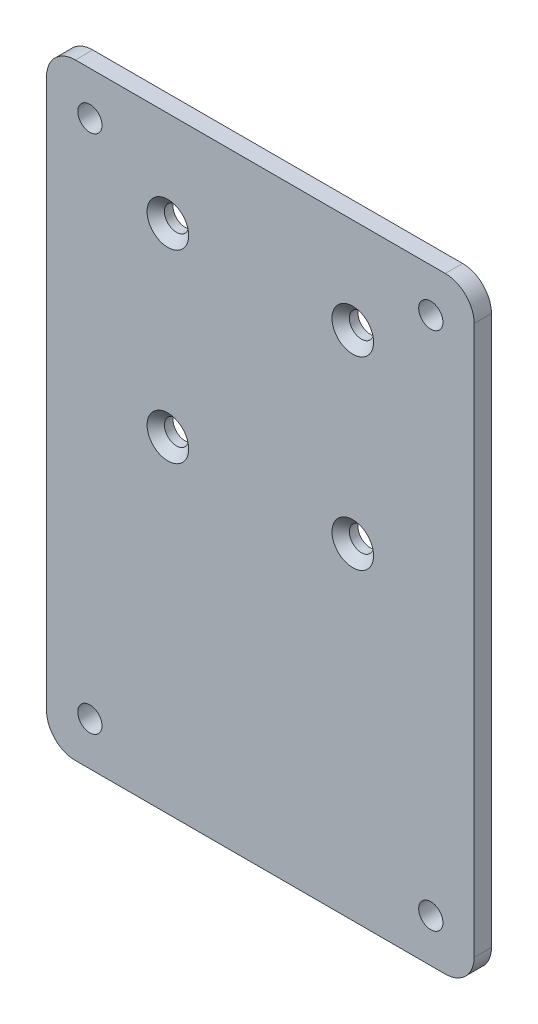
ISO-10303-21;
HEADER;
FILE_DESCRIPTION(('STEP AP214'),'2;1');
FILE_NAME('part.step','',(''),(''),'','','');
FILE_SCHEMA(('AUTOMOTIVE_DESIGN { 1 0 10303 214 1 1 1 1 }'));
ENDSEC;
DATA;
#1=APPLICATION_CONTEXT('core data for automotive mechanical design processes');
#2=APPLICATION_PROTOCOL_DEFINITION('international standard','automotive_design',2000,#1);
#3=PRODUCT_CONTEXT('',#1,'mechanical');
#4=PRODUCT('Part','Part','',(#3));
#5=PRODUCT_RELATED_PRODUCT_CATEGORY('part','',(#4));
#6=PRODUCT_DEFINITION_FORMATION('','',#4);
#7=PRODUCT_DEFINITION_CONTEXT('part definition',#1,'design');
#8=PRODUCT_DEFINITION('design','',#6,#7);
#9=PRODUCT_DEFINITION_SHAPE('','',#8);
#10=(LENGTH_UNIT() NAMED_UNIT(*) SI_UNIT(.MILLI.,.METRE.));
#11=(NAMED_UNIT(*) PLANE_ANGLE_UNIT() SI_UNIT($,.RADIAN.));
#12=(NAMED_UNIT(*) SI_UNIT($,.STERADIAN.) SOLID_ANGLE_UNIT());
#13=UNCERTAINTY_MEASURE_WITH_UNIT(LENGTH_MEASURE(1.E-05),#10,'distance_accuracy_value','');
#14=(GEOMETRIC_REPRESENTATION_CONTEXT(3) GLOBAL_UNCERTAINTY_ASSIGNED_CONTEXT((#13)) GLOBAL_UNIT_ASSIGNED_CONTEXT((#10,
#11,#12)) REPRESENTATION_CONTEXT('',''));
#15=CARTESIAN_POINT('',(0.,0.,0.));
#16=DIRECTION('',(0.,0.,1.));
#17=DIRECTION('',(1.,0.,0.));
#18=AXIS2_PLACEMENT_3D('',#15,#16,#17);
#19=CARTESIAN_POINT('',(0.,0.,3.));
#20=DIRECTION('',(0.,0.,1.));
#21=DIRECTION('',(1.,0.,0.));
#22=AXIS2_PLACEMENT_3D('',#19,#20,#21);
#23=PLANE('',#22);
#24=CARTESIAN_POINT('',(16.,4.,3.));
#25=DIRECTION('',(0.,0.,1.));
#26=DIRECTION('',(1.,0.,0.));
#27=AXIS2_PLACEMENT_3D('',#24,#25,#26);
#28=CIRCLE('',#27,3.59999999999999);
#29=CARTESIAN_POINT('',(19.6,4.,3.));
#30=VERTEX_POINT('',#29);
#31=EDGE_CURVE('E184',#30,#30,#28,.F.);
#32=ORIENTED_EDGE('',*,*,#31,.T.);
#33=EDGE_LOOP('',(#32));
#34=FACE_BOUND('',#33,.T.);
#35=CARTESIAN_POINT('',(-16.,4.,3.));
#36=DIRECTION('',(0.,0.,1.));
#37=DIRECTION('',(1.,0.,0.));
#38=AXIS2_PLACEMENT_3D('',#35,#36,#37);
#39=CIRCLE('',#38,3.59999999999999);
#40=CARTESIAN_POINT('',(-12.4,4.,3.));
#41=VERTEX_POINT('',#40);
#42=EDGE_CURVE('E181',#41,#41,#39,.F.);
#43=ORIENTED_EDGE('',*,*,#42,.T.);
#44=EDGE_LOOP('',(#43));
#45=FACE_BOUND('',#44,.T.);
#46=CARTESIAN_POINT('',(-16.,36.,3.));
#47=DIRECTION('',(0.,0.,1.));
#48=DIRECTION('',(1.,0.,0.));
#49=AXIS2_PLACEMENT_3D('',#46,#47,#48);
#50=CIRCLE('',#49,3.59999999999999);
#51=CARTESIAN_POINT('',(-12.4,36.,3.));
#52=VERTEX_POINT('',#51);
#53=EDGE_CURVE('E178',#52,#52,#50,.F.);
#54=ORIENTED_EDGE('',*,*,#53,.T.);
#55=EDGE_LOOP('',(#54));
#56=FACE_BOUND('',#55,.T.);
#57=CARTESIAN_POINT('',(16.,36.,3.));
#58=DIRECTION('',(0.,0.,1.));
#59=DIRECTION('',(1.,0.,0.));
#60=AXIS2_PLACEMENT_3D('',#57,#58,#59);
#61=CIRCLE('',#60,3.59999999999999);
#62=CARTESIAN_POINT('',(19.6,36.,3.));
#63=VERTEX_POINT('',#62);
#64=EDGE_CURVE('E175',#63,#63,#61,.F.);
#65=ORIENTED_EDGE('',*,*,#64,.T.);
#66=EDGE_LOOP('',(#65));
#67=FACE_BOUND('',#66,.T.);
#68=CARTESIAN_POINT('',(29.5,45.,3.));
#69=DIRECTION('',(0.,0.,1.));
#70=DIRECTION('',(1.,0.,0.));
#71=AXIS2_PLACEMENT_3D('',#68,#69,#70);
#72=CIRCLE('',#71,2.10000000000002);
#73=CARTESIAN_POINT('',(31.6,45.,3.));
#74=VERTEX_POINT('',#73);
#75=EDGE_CURVE('E322',#74,#74,#72,.T.);
#76=ORIENTED_EDGE('',*,*,#75,.F.);
#77=EDGE_LOOP('',(#76));
#78=FACE_BOUND('',#77,.T.);
#79=CARTESIAN_POINT('',(-29.5,45.,3.));
#80=DIRECTION('',(0.,0.,1.));
#81=DIRECTION('',(1.,0.,0.));
#82=AXIS2_PLACEMENT_3D('',#79,#80,#81);
#83=CIRCLE('',#82,2.1);
#84=CARTESIAN_POINT('',(-27.4,45.,3.));
#85=VERTEX_POINT('',#84);
#86=EDGE_CURVE('E278',#85,#85,#83,.T.);
#87=ORIENTED_EDGE('',*,*,#86,.F.);
#88=EDGE_LOOP('',(#87));
#89=FACE_BOUND('',#88,.T.);
#90=DIRECTION('',(0.,-1.,0.));
#91=VECTOR('',#90,1.);
#92=CARTESIAN_POINT('',(-37.,52.5,3.));
#93=LINE('',#92,#91);
#94=CARTESIAN_POINT('',(-37.,47.5,3.));
#95=VERTEX_POINT('',#94);
#96=CARTESIAN_POINT('',(-37.,-47.5,3.));
#97=VERTEX_POINT('',#96);
#98=EDGE_CURVE('E295',#95,#97,#93,.T.);
#99=ORIENTED_EDGE('',*,*,#98,.T.);
#100=CARTESIAN_POINT('',(-32.,-47.5,3.));
#101=DIRECTION('',(0.,0.,1.));
#102=DIRECTION('',(1.,0.,0.));
#103=AXIS2_PLACEMENT_3D('',#100,#101,#102);
#104=CIRCLE('',#103,5.);
#105=CARTESIAN_POINT('',(-32.,-52.5,3.));
#106=VERTEX_POINT('',#105);
#107=EDGE_CURVE('E161',#97,#106,#104,.T.);
#108=ORIENTED_EDGE('',*,*,#107,.T.);
#109=DIRECTION('',(1.,0.,0.));
#110=VECTOR('',#109,1.);
#111=CARTESIAN_POINT('',(-37.,-52.5,3.));
#112=LINE('',#111,#110);
#113=CARTESIAN_POINT('',(32.,-52.5,3.));
#114=VERTEX_POINT('',#113);
#115=EDGE_CURVE('E132',#106,#114,#112,.T.);
#116=ORIENTED_EDGE('',*,*,#115,.T.);
#117=CARTESIAN_POINT('',(32.,-47.5,3.));
#118=DIRECTION('',(0.,0.,1.));
#119=DIRECTION('',(1.,0.,0.));
#120=AXIS2_PLACEMENT_3D('',#117,#118,#119);
#121=CIRCLE('',#120,5.);
#122=CARTESIAN_POINT('',(37.,-47.5,3.));
#123=VERTEX_POINT('',#122);
#124=EDGE_CURVE('E159',#114,#123,#121,.T.);
#125=ORIENTED_EDGE('',*,*,#124,.T.);
#126=DIRECTION('',(0.,1.,0.));
#127=VECTOR('',#126,1.);
#128=CARTESIAN_POINT('',(37.,52.5,3.));
#129=LINE('',#128,#127);
#130=CARTESIAN_POINT('',(37.,47.5,3.));
#131=VERTEX_POINT('',#130);
#132=EDGE_CURVE('E139',#123,#131,#129,.T.);
#133=ORIENTED_EDGE('',*,*,#132,.T.);
#134=CARTESIAN_POINT('',(32.,47.5,3.));
#135=DIRECTION('',(0.,0.,1.));
#136=DIRECTION('',(1.,0.,0.));
#137=AXIS2_PLACEMENT_3D('',#134,#135,#136);
#138=CIRCLE('',#137,5.);
#139=CARTESIAN_POINT('',(32.,52.5,3.));
#140=VERTEX_POINT('',#139);
#141=EDGE_CURVE('E67',#131,#140,#138,.T.);
#142=ORIENTED_EDGE('',*,*,#141,.T.);
#143=DIRECTION('',(-1.,0.,0.));
#144=VECTOR('',#143,1.);
#145=CARTESIAN_POINT('',(-37.,52.5,3.));
#146=LINE('',#145,#144);
#147=CARTESIAN_POINT('',(-32.,52.5,3.));
#148=VERTEX_POINT('',#147);
#149=EDGE_CURVE('E142',#140,#148,#146,.T.);
#150=ORIENTED_EDGE('',*,*,#149,.T.);
#151=CARTESIAN_POINT('',(-32.,47.5,3.));
#152=DIRECTION('',(0.,0.,1.));
#153=DIRECTION('',(1.,0.,0.));
#154=AXIS2_PLACEMENT_3D('',#151,#152,#153);
#155=CIRCLE('',#154,5.);
#156=EDGE_CURVE('E157',#148,#95,#155,.T.);
#157=ORIENTED_EDGE('',*,*,#156,.T.);
#158=EDGE_LOOP('',(#99,#108,#116,#125,#133,#142,#150,#157));
#159=FACE_BOUND('',#158,.T.);
#160=CARTESIAN_POINT('',(-29.5,-45.,3.));
#161=DIRECTION('',(0.,0.,1.));
#162=DIRECTION('',(1.,0.,0.));
#163=AXIS2_PLACEMENT_3D('',#160,#161,#162);
#164=CIRCLE('',#163,2.1);
#165=CARTESIAN_POINT('',(-27.4,-45.,3.));
#166=VERTEX_POINT('',#165);
#167=EDGE_CURVE('E313',#166,#166,#164,.T.);
#168=ORIENTED_EDGE('',*,*,#167,.F.);
#169=EDGE_LOOP('',(#168));
#170=FACE_BOUND('',#169,.T.);
#171=CARTESIAN_POINT('',(29.5,-45.,3.));
#172=DIRECTION('',(0.,0.,1.));
#173=DIRECTION('',(1.,0.,0.));
#174=AXIS2_PLACEMENT_3D('',#171,#172,#173);
#175=CIRCLE('',#174,2.10000000000002);
#176=CARTESIAN_POINT('',(31.6,-45.,3.));
#177=VERTEX_POINT('',#176);
#178=EDGE_CURVE('E316',#177,#177,#175,.T.);
#179=ORIENTED_EDGE('',*,*,#178,.F.);
#180=EDGE_LOOP('',(#179));
#181=FACE_BOUND('',#180,.T.);
#182=ADVANCED_FACE('F44',(#34,#45,#56,#67,#78,#89,#159,#170,#181),#23,.T.);
#183=CARTESIAN_POINT('',(0.,0.,0.));
#184=DIRECTION('',(0.,0.,1.));
#185=DIRECTION('',(1.,0.,0.));
#186=AXIS2_PLACEMENT_3D('',#183,#184,#185);
#187=PLANE('',#186);
#188=DIRECTION('',(1.,0.,0.));
#189=VECTOR('',#188,1.);
#190=CARTESIAN_POINT('',(-37.,-52.5,0.));
#191=LINE('',#190,#189);
#192=CARTESIAN_POINT('',(-32.,-52.5,0.));
#193=VERTEX_POINT('',#192);
#194=CARTESIAN_POINT('',(32.,-52.5,0.));
#195=VERTEX_POINT('',#194);
#196=EDGE_CURVE('E129',#193,#195,#191,.T.);
#197=ORIENTED_EDGE('',*,*,#196,.F.);
#198=CARTESIAN_POINT('',(-32.,-47.5,0.));
#199=DIRECTION('',(0.,0.,1.));
#200=DIRECTION('',(1.,0.,0.));
#201=AXIS2_PLACEMENT_3D('',#198,#199,#200);
#202=CIRCLE('',#201,5.);
#203=CARTESIAN_POINT('',(-37.,-47.5,0.));
#204=VERTEX_POINT('',#203);
#205=EDGE_CURVE('E112',#193,#204,#202,.F.);
#206=ORIENTED_EDGE('',*,*,#205,.T.);
#207=DIRECTION('',(0.,-1.,0.));
#208=VECTOR('',#207,1.);
#209=CARTESIAN_POINT('',(-37.,52.5,0.));
#210=LINE('',#209,#208);
#211=CARTESIAN_POINT('',(-37.,47.5,0.));
#212=VERTEX_POINT('',#211);
#213=EDGE_CURVE('E140',#212,#204,#210,.T.);
#214=ORIENTED_EDGE('',*,*,#213,.F.);
#215=CARTESIAN_POINT('',(-32.,47.5,0.));
#216=DIRECTION('',(0.,0.,1.));
#217=DIRECTION('',(1.,0.,0.));
#218=AXIS2_PLACEMENT_3D('',#215,#216,#217);
#219=CIRCLE('',#218,5.);
#220=CARTESIAN_POINT('',(-32.,52.5,0.));
#221=VERTEX_POINT('',#220);
#222=EDGE_CURVE('E150',#212,#221,#219,.F.);
#223=ORIENTED_EDGE('',*,*,#222,.T.);
#224=DIRECTION('',(-1.,0.,0.));
#225=VECTOR('',#224,1.);
#226=CARTESIAN_POINT('',(-37.,52.5,0.));
#227=LINE('',#226,#225);
#228=CARTESIAN_POINT('',(32.,52.5,0.));
#229=VERTEX_POINT('',#228);
#230=EDGE_CURVE('E144',#229,#221,#227,.T.);
#231=ORIENTED_EDGE('',*,*,#230,.F.);
#232=CARTESIAN_POINT('',(32.,47.5,0.));
#233=DIRECTION('',(0.,0.,1.));
#234=DIRECTION('',(1.,0.,0.));
#235=AXIS2_PLACEMENT_3D('',#232,#233,#234);
#236=CIRCLE('',#235,5.);
#237=CARTESIAN_POINT('',(37.,47.5,0.));
#238=VERTEX_POINT('',#237);
#239=EDGE_CURVE('E133',#229,#238,#236,.F.);
#240=ORIENTED_EDGE('',*,*,#239,.T.);
#241=DIRECTION('',(0.,1.,0.));
#242=VECTOR('',#241,1.);
#243=CARTESIAN_POINT('',(37.,52.5,0.));
#244=LINE('',#243,#242);
#245=CARTESIAN_POINT('',(37.,-47.5,0.));
#246=VERTEX_POINT('',#245);
#247=EDGE_CURVE('E292',#246,#238,#244,.T.);
#248=ORIENTED_EDGE('',*,*,#247,.F.);
#249=CARTESIAN_POINT('',(32.,-47.5,0.));
#250=DIRECTION('',(0.,0.,1.));
#251=DIRECTION('',(1.,0.,0.));
#252=AXIS2_PLACEMENT_3D('',#249,#250,#251);
#253=CIRCLE('',#252,5.);
#254=EDGE_CURVE('E123',#246,#195,#253,.F.);
#255=ORIENTED_EDGE('',*,*,#254,.T.);
#256=EDGE_LOOP('',(#197,#206,#214,#223,#231,#240,#248,#255));
#257=FACE_BOUND('',#256,.T.);
#258=CARTESIAN_POINT('',(-16.,36.,0.));
#259=DIRECTION('',(0.,0.,1.));
#260=DIRECTION('',(1.,0.,0.));
#261=AXIS2_PLACEMENT_3D('',#258,#259,#260);
#262=CIRCLE('',#261,2.1);
#263=CARTESIAN_POINT('',(-13.9,36.,0.));
#264=VERTEX_POINT('',#263);
#265=EDGE_CURVE('E290',#264,#264,#262,.T.);
#266=ORIENTED_EDGE('',*,*,#265,.T.);
#267=EDGE_LOOP('',(#266));
#268=FACE_BOUND('',#267,.T.);
#269=CARTESIAN_POINT('',(16.,36.,0.));
#270=DIRECTION('',(0.,0.,1.));
#271=DIRECTION('',(1.,0.,0.));
#272=AXIS2_PLACEMENT_3D('',#269,#270,#271);
#273=CIRCLE('',#272,2.1);
#274=CARTESIAN_POINT('',(18.1,36.,0.));
#275=VERTEX_POINT('',#274);
#276=EDGE_CURVE('E281',#275,#275,#273,.T.);
#277=ORIENTED_EDGE('',*,*,#276,.T.);
#278=EDGE_LOOP('',(#277));
#279=FACE_BOUND('',#278,.T.);
#280=CARTESIAN_POINT('',(-16.,4.,0.));
#281=DIRECTION('',(0.,0.,1.));
#282=DIRECTION('',(1.,0.,0.));
#283=AXIS2_PLACEMENT_3D('',#280,#281,#282);
#284=CIRCLE('',#283,2.1);
#285=CARTESIAN_POINT('',(-13.9,4.,0.));
#286=VERTEX_POINT('',#285);
#287=EDGE_CURVE('E277',#286,#286,#284,.T.);
#288=ORIENTED_EDGE('',*,*,#287,.T.);
#289=EDGE_LOOP('',(#288));
#290=FACE_BOUND('',#289,.T.);
#291=CARTESIAN_POINT('',(16.,4.,0.));
#292=DIRECTION('',(0.,0.,1.));
#293=DIRECTION('',(1.,0.,0.));
#294=AXIS2_PLACEMENT_3D('',#291,#292,#293);
#295=CIRCLE('',#294,2.1);
#296=CARTESIAN_POINT('',(18.1,4.,0.));
#297=VERTEX_POINT('',#296);
#298=EDGE_CURVE('E275',#297,#297,#295,.T.);
#299=ORIENTED_EDGE('',*,*,#298,.T.);
#300=EDGE_LOOP('',(#299));
#301=FACE_BOUND('',#300,.T.);
#302=CARTESIAN_POINT('',(-29.5,45.,0.));
#303=DIRECTION('',(0.,0.,1.));
#304=DIRECTION('',(1.,0.,0.));
#305=AXIS2_PLACEMENT_3D('',#302,#303,#304);
#306=CIRCLE('',#305,2.1);
#307=CARTESIAN_POINT('',(-27.4,45.,0.));
#308=VERTEX_POINT('',#307);
#309=EDGE_CURVE('E284',#308,#308,#306,.T.);
#310=ORIENTED_EDGE('',*,*,#309,.T.);
#311=EDGE_LOOP('',(#310));
#312=FACE_BOUND('',#311,.T.);
#313=CARTESIAN_POINT('',(-29.5,-45.,0.));
#314=DIRECTION('',(0.,0.,1.));
#315=DIRECTION('',(1.,0.,0.));
#316=AXIS2_PLACEMENT_3D('',#313,#314,#315);
#317=CIRCLE('',#316,2.1);
#318=CARTESIAN_POINT('',(-27.4,-45.,0.));
#319=VERTEX_POINT('',#318);
#320=EDGE_CURVE('E328',#319,#319,#317,.T.);
#321=ORIENTED_EDGE('',*,*,#320,.T.);
#322=EDGE_LOOP('',(#321));
#323=FACE_BOUND('',#322,.T.);
#324=CARTESIAN_POINT('',(29.5,45.,0.));
#325=DIRECTION('',(0.,0.,1.));
#326=DIRECTION('',(1.,0.,0.));
#327=AXIS2_PLACEMENT_3D('',#324,#325,#326);
#328=CIRCLE('',#327,2.10000000000002);
#329=CARTESIAN_POINT('',(31.6,45.,0.));
#330=VERTEX_POINT('',#329);
#331=EDGE_CURVE('E318',#330,#330,#328,.T.);
#332=ORIENTED_EDGE('',*,*,#331,.T.);
#333=EDGE_LOOP('',(#332));
#334=FACE_BOUND('',#333,.T.);
#335=CARTESIAN_POINT('',(29.5,-45.,0.));
#336=DIRECTION('',(0.,0.,1.));
#337=DIRECTION('',(1.,0.,0.));
#338=AXIS2_PLACEMENT_3D('',#335,#336,#337);
#339=CIRCLE('',#338,2.10000000000002);
#340=CARTESIAN_POINT('',(31.6,-45.,0.));
#341=VERTEX_POINT('',#340);
#342=EDGE_CURVE('E319',#341,#341,#339,.T.);
#343=ORIENTED_EDGE('',*,*,#342,.T.);
#344=EDGE_LOOP('',(#343));
#345=FACE_BOUND('',#344,.T.);
#346=ADVANCED_FACE('F136',(#257,#268,#279,#290,#301,#312,#323,#334,#345),#187,.F.);
#347=CARTESIAN_POINT('',(37.,52.5,3.));
#348=DIRECTION('',(-1.,0.,0.));
#349=DIRECTION('',(0.,0.,1.));
#350=AXIS2_PLACEMENT_3D('',#347,#348,#349);
#351=PLANE('',#350);
#352=ORIENTED_EDGE('',*,*,#132,.F.);
#353=DIRECTION('',(0.,0.,-1.));
#354=VECTOR('',#353,1.);
#355=CARTESIAN_POINT('',(37.,-47.5,3.));
#356=LINE('',#355,#354);
#357=EDGE_CURVE('E165',#123,#246,#356,.T.);
#358=ORIENTED_EDGE('',*,*,#357,.T.);
#359=ORIENTED_EDGE('',*,*,#247,.T.);
#360=DIRECTION('',(0.,0.,-1.));
#361=VECTOR('',#360,1.);
#362=CARTESIAN_POINT('',(37.,47.5,3.));
#363=LINE('',#362,#361);
#364=EDGE_CURVE('E163',#238,#131,#363,.F.);
#365=ORIENTED_EDGE('',*,*,#364,.T.);
#366=EDGE_LOOP('',(#352,#358,#359,#365));
#367=FACE_BOUND('',#366,.T.);
#368=ADVANCED_FACE('F217',(#367),#351,.F.);
#369=CARTESIAN_POINT('',(-37.,52.5,3.));
#370=DIRECTION('',(0.,-1.,0.));
#371=DIRECTION('',(0.,0.,-1.));
#372=AXIS2_PLACEMENT_3D('',#369,#370,#371);
#373=PLANE('',#372);
#374=ORIENTED_EDGE('',*,*,#230,.T.);
#375=DIRECTION('',(0.,0.,-1.));
#376=VECTOR('',#375,1.);
#377=CARTESIAN_POINT('',(-32.,52.5,3.));
#378=LINE('',#377,#376);
#379=EDGE_CURVE('E60',#221,#148,#378,.F.);
#380=ORIENTED_EDGE('',*,*,#379,.T.);
#381=ORIENTED_EDGE('',*,*,#149,.F.);
#382=DIRECTION('',(0.,0.,-1.));
#383=VECTOR('',#382,1.);
#384=CARTESIAN_POINT('',(32.,52.5,3.));
#385=LINE('',#384,#383);
#386=EDGE_CURVE('E168',#140,#229,#385,.T.);
#387=ORIENTED_EDGE('',*,*,#386,.T.);
#388=EDGE_LOOP('',(#374,#380,#381,#387));
#389=FACE_BOUND('',#388,.T.);
#390=ADVANCED_FACE('F228',(#389),#373,.F.);
#391=CARTESIAN_POINT('',(-37.,52.5,3.));
#392=DIRECTION('',(1.,0.,0.));
#393=DIRECTION('',(0.,0.,-1.));
#394=AXIS2_PLACEMENT_3D('',#391,#392,#393);
#395=PLANE('',#394);
#396=ORIENTED_EDGE('',*,*,#213,.T.);
#397=DIRECTION('',(0.,0.,-1.));
#398=VECTOR('',#397,1.);
#399=CARTESIAN_POINT('',(-37.,-47.5,3.));
#400=LINE('',#399,#398);
#401=EDGE_CURVE('E117',#204,#97,#400,.F.);
#402=ORIENTED_EDGE('',*,*,#401,.T.);
#403=ORIENTED_EDGE('',*,*,#98,.F.);
#404=DIRECTION('',(0.,0.,-1.));
#405=VECTOR('',#404,1.);
#406=CARTESIAN_POINT('',(-37.,47.5,3.));
#407=LINE('',#406,#405);
#408=EDGE_CURVE('E122',#95,#212,#407,.T.);
#409=ORIENTED_EDGE('',*,*,#408,.T.);
#410=EDGE_LOOP('',(#396,#402,#403,#409));
#411=FACE_BOUND('',#410,.T.);
#412=ADVANCED_FACE('F225',(#411),#395,.F.);
#413=CARTESIAN_POINT('',(-37.,-52.5,3.));
#414=DIRECTION('',(0.,1.,0.));
#415=DIRECTION('',(0.,0.,1.));
#416=AXIS2_PLACEMENT_3D('',#413,#414,#415);
#417=PLANE('',#416);
#418=ORIENTED_EDGE('',*,*,#115,.F.);
#419=DIRECTION('',(0.,0.,-1.));
#420=VECTOR('',#419,1.);
#421=CARTESIAN_POINT('',(-32.,-52.5,3.));
#422=LINE('',#421,#420);
#423=EDGE_CURVE('E116',#106,#193,#422,.T.);
#424=ORIENTED_EDGE('',*,*,#423,.T.);
#425=ORIENTED_EDGE('',*,*,#196,.T.);
#426=DIRECTION('',(0.,0.,-1.));
#427=VECTOR('',#426,1.);
#428=CARTESIAN_POINT('',(32.,-52.5,3.));
#429=LINE('',#428,#427);
#430=EDGE_CURVE('E134',#195,#114,#429,.F.);
#431=ORIENTED_EDGE('',*,*,#430,.T.);
#432=EDGE_LOOP('',(#418,#424,#425,#431));
#433=FACE_BOUND('',#432,.T.);
#434=ADVANCED_FACE('F128',(#433),#417,.F.);
#435=CARTESIAN_POINT('',(-16.,36.,3.));
#436=DIRECTION('',(0.,0.,-1.));
#437=DIRECTION('',(-1.,0.,0.));
#438=AXIS2_PLACEMENT_3D('',#435,#436,#437);
#439=CYLINDRICAL_SURFACE('',#438,2.1);
#440=CARTESIAN_POINT('',(-16.,36.,1.5));
#441=DIRECTION('',(0.,0.,1.));
#442=DIRECTION('',(1.,0.,0.));
#443=AXIS2_PLACEMENT_3D('',#440,#441,#442);
#444=CIRCLE('',#443,2.1);
#445=CARTESIAN_POINT('',(-13.9,36.,1.5));
#446=VERTEX_POINT('',#445);
#447=EDGE_CURVE('E53',#446,#446,#444,.T.);
#448=ORIENTED_EDGE('',*,*,#447,.T.);
#449=EDGE_LOOP('',(#448));
#450=FACE_BOUND('',#449,.T.);
#451=ORIENTED_EDGE('',*,*,#265,.F.);
#452=EDGE_LOOP('',(#451));
#453=FACE_BOUND('',#452,.T.);
#454=ADVANCED_FACE('F192',(#450,#453),#439,.F.);
#455=CARTESIAN_POINT('',(16.,36.,3.));
#456=DIRECTION('',(0.,0.,-1.));
#457=DIRECTION('',(-1.,0.,0.));
#458=AXIS2_PLACEMENT_3D('',#455,#456,#457);
#459=CYLINDRICAL_SURFACE('',#458,2.1);
#460=CARTESIAN_POINT('',(16.,36.,1.5));
#461=DIRECTION('',(0.,0.,1.));
#462=DIRECTION('',(1.,0.,0.));
#463=AXIS2_PLACEMENT_3D('',#460,#461,#462);
#464=CIRCLE('',#463,2.1);
#465=CARTESIAN_POINT('',(18.1,36.,1.5));
#466=VERTEX_POINT('',#465);
#467=EDGE_CURVE('E11',#466,#466,#464,.T.);
#468=ORIENTED_EDGE('',*,*,#467,.T.);
#469=EDGE_LOOP('',(#468));
#470=FACE_BOUND('',#469,.T.);
#471=ORIENTED_EDGE('',*,*,#276,.F.);
#472=EDGE_LOOP('',(#471));
#473=FACE_BOUND('',#472,.T.);
#474=ADVANCED_FACE('F352',(#470,#473),#459,.F.);
#475=CARTESIAN_POINT('',(-16.,4.,3.));
#476=DIRECTION('',(0.,0.,-1.));
#477=DIRECTION('',(-1.,0.,0.));
#478=AXIS2_PLACEMENT_3D('',#475,#476,#477);
#479=CYLINDRICAL_SURFACE('',#478,2.1);
#480=CARTESIAN_POINT('',(-16.,4.,1.5));
#481=DIRECTION('',(0.,0.,1.));
#482=DIRECTION('',(1.,0.,0.));
#483=AXIS2_PLACEMENT_3D('',#480,#481,#482);
#484=CIRCLE('',#483,2.1);
#485=CARTESIAN_POINT('',(-13.9,4.,1.5));
#486=VERTEX_POINT('',#485);
#487=EDGE_CURVE('E187',#486,#486,#484,.T.);
#488=ORIENTED_EDGE('',*,*,#487,.T.);
#489=EDGE_LOOP('',(#488));
#490=FACE_BOUND('',#489,.T.);
#491=ORIENTED_EDGE('',*,*,#287,.F.);
#492=EDGE_LOOP('',(#491));
#493=FACE_BOUND('',#492,.T.);
#494=ADVANCED_FACE('F271',(#490,#493),#479,.F.);
#495=CARTESIAN_POINT('',(16.,4.,3.));
#496=DIRECTION('',(0.,0.,-1.));
#497=DIRECTION('',(-1.,0.,0.));
#498=AXIS2_PLACEMENT_3D('',#495,#496,#497);
#499=CYLINDRICAL_SURFACE('',#498,2.1);
#500=CARTESIAN_POINT('',(16.,4.,1.5));
#501=DIRECTION('',(0.,0.,1.));
#502=DIRECTION('',(1.,0.,0.));
#503=AXIS2_PLACEMENT_3D('',#500,#501,#502);
#504=CIRCLE('',#503,2.1);
#505=CARTESIAN_POINT('',(18.1,4.,1.5));
#506=VERTEX_POINT('',#505);
#507=EDGE_CURVE('E172',#506,#506,#504,.T.);
#508=ORIENTED_EDGE('',*,*,#507,.T.);
#509=EDGE_LOOP('',(#508));
#510=FACE_BOUND('',#509,.T.);
#511=ORIENTED_EDGE('',*,*,#298,.F.);
#512=EDGE_LOOP('',(#511));
#513=FACE_BOUND('',#512,.T.);
#514=ADVANCED_FACE('F268',(#510,#513),#499,.F.);
#515=CARTESIAN_POINT('',(-29.5,45.,3.));
#516=DIRECTION('',(0.,0.,-1.));
#517=DIRECTION('',(-1.,0.,0.));
#518=AXIS2_PLACEMENT_3D('',#515,#516,#517);
#519=CYLINDRICAL_SURFACE('',#518,2.1);
#520=ORIENTED_EDGE('',*,*,#86,.T.);
#521=EDGE_LOOP('',(#520));
#522=FACE_BOUND('',#521,.T.);
#523=ORIENTED_EDGE('',*,*,#309,.F.);
#524=EDGE_LOOP('',(#523));
#525=FACE_BOUND('',#524,.T.);
#526=ADVANCED_FACE('F270',(#522,#525),#519,.F.);
#527=CARTESIAN_POINT('',(-29.5,-45.,3.));
#528=DIRECTION('',(0.,0.,-1.));
#529=DIRECTION('',(-1.,0.,0.));
#530=AXIS2_PLACEMENT_3D('',#527,#528,#529);
#531=CYLINDRICAL_SURFACE('',#530,2.1);
#532=ORIENTED_EDGE('',*,*,#167,.T.);
#533=EDGE_LOOP('',(#532));
#534=FACE_BOUND('',#533,.T.);
#535=ORIENTED_EDGE('',*,*,#320,.F.);
#536=EDGE_LOOP('',(#535));
#537=FACE_BOUND('',#536,.T.);
#538=ADVANCED_FACE('F336',(#534,#537),#531,.F.);
#539=CARTESIAN_POINT('',(29.5,45.,3.));
#540=DIRECTION('',(0.,0.,-1.));
#541=DIRECTION('',(-1.,0.,0.));
#542=AXIS2_PLACEMENT_3D('',#539,#540,#541);
#543=CYLINDRICAL_SURFACE('',#542,2.10000000000002);
#544=ORIENTED_EDGE('',*,*,#75,.T.);
#545=EDGE_LOOP('',(#544));
#546=FACE_BOUND('',#545,.T.);
#547=ORIENTED_EDGE('',*,*,#331,.F.);
#548=EDGE_LOOP('',(#547));
#549=FACE_BOUND('',#548,.T.);
#550=ADVANCED_FACE('F338',(#546,#549),#543,.F.);
#551=CARTESIAN_POINT('',(29.5,-45.,3.));
#552=DIRECTION('',(0.,0.,-1.));
#553=DIRECTION('',(-1.,0.,0.));
#554=AXIS2_PLACEMENT_3D('',#551,#552,#553);
#555=CYLINDRICAL_SURFACE('',#554,2.10000000000002);
#556=ORIENTED_EDGE('',*,*,#178,.T.);
#557=EDGE_LOOP('',(#556));
#558=FACE_BOUND('',#557,.T.);
#559=ORIENTED_EDGE('',*,*,#342,.F.);
#560=EDGE_LOOP('',(#559));
#561=FACE_BOUND('',#560,.T.);
#562=ADVANCED_FACE('F238',(#558,#561),#555,.F.);
#563=CARTESIAN_POINT('',(-32.,-47.5,3.));
#564=DIRECTION('',(0.,0.,-1.));
#565=DIRECTION('',(-1.,0.,0.));
#566=AXIS2_PLACEMENT_3D('',#563,#564,#565);
#567=CYLINDRICAL_SURFACE('',#566,5.);
#568=ORIENTED_EDGE('',*,*,#107,.F.);
#569=ORIENTED_EDGE('',*,*,#401,.F.);
#570=ORIENTED_EDGE('',*,*,#205,.F.);
#571=ORIENTED_EDGE('',*,*,#423,.F.);
#572=EDGE_LOOP('',(#568,#569,#570,#571));
#573=FACE_BOUND('',#572,.T.);
#574=ADVANCED_FACE('F115',(#573),#567,.T.);
#575=CARTESIAN_POINT('',(32.,-47.5,3.));
#576=DIRECTION('',(0.,0.,-1.));
#577=DIRECTION('',(-1.,0.,0.));
#578=AXIS2_PLACEMENT_3D('',#575,#576,#577);
#579=CYLINDRICAL_SURFACE('',#578,5.);
#580=ORIENTED_EDGE('',*,*,#124,.F.);
#581=ORIENTED_EDGE('',*,*,#430,.F.);
#582=ORIENTED_EDGE('',*,*,#254,.F.);
#583=ORIENTED_EDGE('',*,*,#357,.F.);
#584=EDGE_LOOP('',(#580,#581,#582,#583));
#585=FACE_BOUND('',#584,.T.);
#586=ADVANCED_FACE('F237',(#585),#579,.T.);
#587=CARTESIAN_POINT('',(-32.,47.5,3.));
#588=DIRECTION('',(0.,0.,-1.));
#589=DIRECTION('',(-1.,0.,0.));
#590=AXIS2_PLACEMENT_3D('',#587,#588,#589);
#591=CYLINDRICAL_SURFACE('',#590,5.);
#592=ORIENTED_EDGE('',*,*,#156,.F.);
#593=ORIENTED_EDGE('',*,*,#379,.F.);
#594=ORIENTED_EDGE('',*,*,#222,.F.);
#595=ORIENTED_EDGE('',*,*,#408,.F.);
#596=EDGE_LOOP('',(#592,#593,#594,#595));
#597=FACE_BOUND('',#596,.T.);
#598=ADVANCED_FACE('F241',(#597),#591,.T.);
#599=CARTESIAN_POINT('',(32.,47.5,3.));
#600=DIRECTION('',(0.,0.,-1.));
#601=DIRECTION('',(-1.,0.,0.));
#602=AXIS2_PLACEMENT_3D('',#599,#600,#601);
#603=CYLINDRICAL_SURFACE('',#602,5.);
#604=ORIENTED_EDGE('',*,*,#141,.F.);
#605=ORIENTED_EDGE('',*,*,#364,.F.);
#606=ORIENTED_EDGE('',*,*,#239,.F.);
#607=ORIENTED_EDGE('',*,*,#386,.F.);
#608=EDGE_LOOP('',(#604,#605,#606,#607));
#609=FACE_BOUND('',#608,.T.);
#610=ADVANCED_FACE('F245',(#609),#603,.T.);
#611=CARTESIAN_POINT('',(16.,4.,1.5));
#612=DIRECTION('',(0.,0.,1.));
#613=DIRECTION('',(1.,0.,0.));
#614=AXIS2_PLACEMENT_3D('',#611,#612,#613);
#615=CONICAL_SURFACE('',#614,2.1,0.785398163397446);
#616=ORIENTED_EDGE('',*,*,#31,.F.);
#617=EDGE_LOOP('',(#616));
#618=FACE_BOUND('',#617,.T.);
#619=ORIENTED_EDGE('',*,*,#507,.F.);
#620=EDGE_LOOP('',(#619));
#621=FACE_BOUND('',#620,.T.);
#622=ADVANCED_FACE('F204',(#618,#621),#615,.F.);
#623=CARTESIAN_POINT('',(-16.,4.,1.5));
#624=DIRECTION('',(0.,0.,1.));
#625=DIRECTION('',(1.,0.,0.));
#626=AXIS2_PLACEMENT_3D('',#623,#624,#625);
#627=CONICAL_SURFACE('',#626,2.1,0.785398163397446);
#628=ORIENTED_EDGE('',*,*,#42,.F.);
#629=EDGE_LOOP('',(#628));
#630=FACE_BOUND('',#629,.T.);
#631=ORIENTED_EDGE('',*,*,#487,.F.);
#632=EDGE_LOOP('',(#631));
#633=FACE_BOUND('',#632,.T.);
#634=ADVANCED_FACE('F197',(#630,#633),#627,.F.);
#635=CARTESIAN_POINT('',(-16.,36.,1.5));
#636=DIRECTION('',(0.,0.,1.));
#637=DIRECTION('',(1.,0.,0.));
#638=AXIS2_PLACEMENT_3D('',#635,#636,#637);
#639=CONICAL_SURFACE('',#638,2.1,0.785398163397446);
#640=ORIENTED_EDGE('',*,*,#53,.F.);
#641=EDGE_LOOP('',(#640));
#642=FACE_BOUND('',#641,.T.);
#643=ORIENTED_EDGE('',*,*,#447,.F.);
#644=EDGE_LOOP('',(#643));
#645=FACE_BOUND('',#644,.T.);
#646=ADVANCED_FACE('F195',(#642,#645),#639,.F.);
#647=CARTESIAN_POINT('',(16.,36.,1.5));
#648=DIRECTION('',(0.,0.,1.));
#649=DIRECTION('',(1.,0.,0.));
#650=AXIS2_PLACEMENT_3D('',#647,#648,#649);
#651=CONICAL_SURFACE('',#650,2.1,0.785398163397446);
#652=ORIENTED_EDGE('',*,*,#64,.F.);
#653=EDGE_LOOP('',(#652));
#654=FACE_BOUND('',#653,.T.);
#655=ORIENTED_EDGE('',*,*,#467,.F.);
#656=EDGE_LOOP('',(#655));
#657=FACE_BOUND('',#656,.T.);
#658=ADVANCED_FACE('F47',(#654,#657),#651,.F.);
#659=CLOSED_SHELL('',(#182,#346,#368,#390,#412,#434,#454,#474,#494,#514,#526,#538,#550,#562,
#574,#586,#598,#610,#622,#634,#646,#658));
#660=MANIFOLD_SOLID_BREP('B2',#659);
#661=ADVANCED_BREP_SHAPE_REPRESENTATION('',(#18,#660),#14);
#662=SHAPE_DEFINITION_REPRESENTATION(#9,#661);
ENDSEC;
END-ISO-10303-21;
